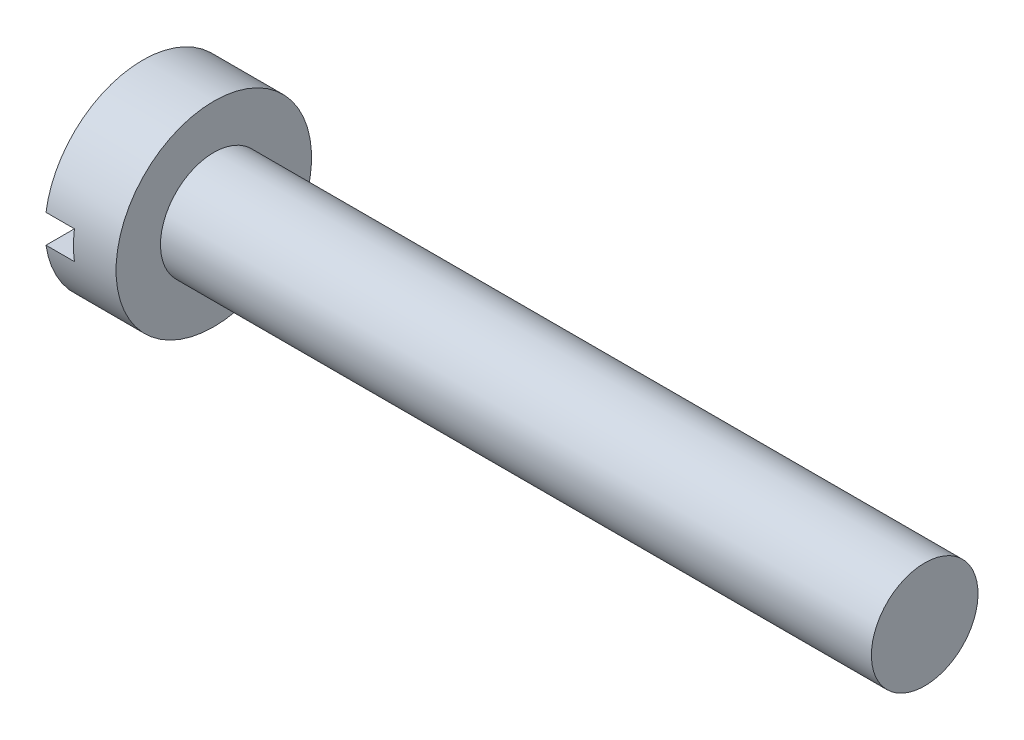
ISO-10303-21;
HEADER;
FILE_DESCRIPTION(('STEP AP214'),'2;1');
FILE_NAME('part.step','',(''),(''),'','','');
FILE_SCHEMA(('AUTOMOTIVE_DESIGN { 1 0 10303 214 1 1 1 1 }'));
ENDSEC;
DATA;
#1=APPLICATION_CONTEXT('core data for automotive mechanical design processes');
#2=APPLICATION_PROTOCOL_DEFINITION('international standard','automotive_design',2000,#1);
#3=PRODUCT_CONTEXT('',#1,'mechanical');
#4=PRODUCT('Part','Part','',(#3));
#5=PRODUCT_RELATED_PRODUCT_CATEGORY('part','',(#4));
#6=PRODUCT_DEFINITION_FORMATION('','',#4);
#7=PRODUCT_DEFINITION_CONTEXT('part definition',#1,'design');
#8=PRODUCT_DEFINITION('design','',#6,#7);
#9=PRODUCT_DEFINITION_SHAPE('','',#8);
#10=(LENGTH_UNIT() NAMED_UNIT(*) SI_UNIT(.MILLI.,.METRE.));
#11=(NAMED_UNIT(*) PLANE_ANGLE_UNIT() SI_UNIT($,.RADIAN.));
#12=(NAMED_UNIT(*) SI_UNIT($,.STERADIAN.) SOLID_ANGLE_UNIT());
#13=UNCERTAINTY_MEASURE_WITH_UNIT(LENGTH_MEASURE(1.E-05),#10,'distance_accuracy_value','');
#14=(GEOMETRIC_REPRESENTATION_CONTEXT(3) GLOBAL_UNCERTAINTY_ASSIGNED_CONTEXT((#13)) GLOBAL_UNIT_ASSIGNED_CONTEXT((#10,
#11,#12)) REPRESENTATION_CONTEXT('',''));
#15=CARTESIAN_POINT('',(0.,0.,0.));
#16=DIRECTION('',(0.,0.,1.));
#17=DIRECTION('',(1.,0.,0.));
#18=AXIS2_PLACEMENT_3D('',#15,#16,#17);
#19=CARTESIAN_POINT('',(0.,0.,0.));
#20=DIRECTION('',(-1.,0.,0.));
#21=DIRECTION('',(0.,-1.,0.));
#22=AXIS2_PLACEMENT_3D('',#19,#20,#21);
#23=PLANE('',#22);
#24=DIRECTION('',(0.,0.,-1.));
#25=VECTOR('',#24,1.);
#26=CARTESIAN_POINT('',(0.,0.399999999999997,-2.75));
#27=LINE('',#26,#25);
#28=CARTESIAN_POINT('',(0.,0.399999999999999,2.72075357208256));
#29=VERTEX_POINT('',#28);
#30=CARTESIAN_POINT('',(0.,0.399999999999997,-2.72075357208256));
#31=VERTEX_POINT('',#30);
#32=EDGE_CURVE('E83',#29,#31,#27,.T.);
#33=ORIENTED_EDGE('',*,*,#32,.F.);
#34=CARTESIAN_POINT('',(0.,0.,0.));
#35=DIRECTION('',(1.,0.,0.));
#36=DIRECTION('',(0.,1.,0.));
#37=AXIS2_PLACEMENT_3D('',#34,#35,#36);
#38=CIRCLE('',#37,2.75);
#39=EDGE_CURVE('E89',#31,#29,#38,.T.);
#40=ORIENTED_EDGE('',*,*,#39,.F.);
#41=EDGE_LOOP('',(#33,#40));
#42=FACE_BOUND('',#41,.T.);
#43=ADVANCED_FACE('F33',(#42),#23,.T.);
#44=DIRECTION('',(0.,0.,1.));
#45=VECTOR('',#44,1.);
#46=CARTESIAN_POINT('',(0.,-0.400000000000001,-2.75));
#47=LINE('',#46,#45);
#48=CARTESIAN_POINT('',(0.,-0.400000000000001,-2.72075357208256));
#49=VERTEX_POINT('',#48);
#50=CARTESIAN_POINT('',(0.,-0.399999999999999,2.72075357208256));
#51=VERTEX_POINT('',#50);
#52=EDGE_CURVE('E77',#49,#51,#47,.T.);
#53=ORIENTED_EDGE('',*,*,#52,.F.);
#54=EDGE_CURVE('E82',#51,#49,#38,.T.);
#55=ORIENTED_EDGE('',*,*,#54,.F.);
#56=EDGE_LOOP('',(#53,#55));
#57=FACE_BOUND('',#56,.T.);
#58=ADVANCED_FACE('F35',(#57),#23,.T.);
#59=CARTESIAN_POINT('',(22.,0.,0.));
#60=DIRECTION('',(1.,0.,0.));
#61=DIRECTION('',(0.,1.,0.));
#62=AXIS2_PLACEMENT_3D('',#59,#60,#61);
#63=CYLINDRICAL_SURFACE('',#62,2.75);
#64=DIRECTION('',(1.,0.,0.));
#65=VECTOR('',#64,1.);
#66=CARTESIAN_POINT('',(22.,0.399999999999997,-2.72075357208256));
#67=LINE('',#66,#65);
#68=CARTESIAN_POINT('',(0.799999999999999,0.399999999999997,-2.72075357208256));
#69=VERTEX_POINT('',#68);
#70=EDGE_CURVE('E11',#31,#69,#67,.T.);
#71=ORIENTED_EDGE('',*,*,#70,.F.);
#72=ORIENTED_EDGE('',*,*,#39,.T.);
#73=DIRECTION('',(1.,0.,0.));
#74=VECTOR('',#73,1.);
#75=CARTESIAN_POINT('',(22.,0.399999999999999,2.72075357208256));
#76=LINE('',#75,#74);
#77=CARTESIAN_POINT('',(0.799999999999999,0.399999999999999,2.72075357208256));
#78=VERTEX_POINT('',#77);
#79=EDGE_CURVE('E98',#78,#29,#76,.F.);
#80=ORIENTED_EDGE('',*,*,#79,.F.);
#81=CARTESIAN_POINT('',(0.799999999999999,0.,0.));
#82=DIRECTION('',(-1.,0.,0.));
#83=DIRECTION('',(0.,0.,1.));
#84=AXIS2_PLACEMENT_3D('',#81,#82,#83);
#85=CIRCLE('',#84,2.75);
#86=CARTESIAN_POINT('',(0.799999999999999,-0.399999999999999,2.72075357208256));
#87=VERTEX_POINT('',#86);
#88=EDGE_CURVE('E48',#78,#87,#85,.F.);
#89=ORIENTED_EDGE('',*,*,#88,.T.);
#90=DIRECTION('',(1.,0.,0.));
#91=VECTOR('',#90,1.);
#92=CARTESIAN_POINT('',(22.,-0.399999999999999,2.72075357208256));
#93=LINE('',#92,#91);
#94=EDGE_CURVE('E88',#51,#87,#93,.T.);
#95=ORIENTED_EDGE('',*,*,#94,.F.);
#96=ORIENTED_EDGE('',*,*,#54,.T.);
#97=DIRECTION('',(1.,0.,0.));
#98=VECTOR('',#97,1.);
#99=CARTESIAN_POINT('',(22.,-0.400000000000001,-2.72075357208256));
#100=LINE('',#99,#98);
#101=CARTESIAN_POINT('',(0.799999999999999,-0.400000000000001,-2.72075357208256));
#102=VERTEX_POINT('',#101);
#103=EDGE_CURVE('E41',#102,#49,#100,.F.);
#104=ORIENTED_EDGE('',*,*,#103,.F.);
#105=EDGE_CURVE('E56',#102,#69,#85,.F.);
#106=ORIENTED_EDGE('',*,*,#105,.T.);
#107=EDGE_LOOP('',(#71,#72,#80,#89,#95,#96,#104,#106));
#108=FACE_BOUND('',#107,.T.);
#109=CARTESIAN_POINT('',(2.,0.,0.));
#110=DIRECTION('',(1.,0.,0.));
#111=DIRECTION('',(0.,1.,0.));
#112=AXIS2_PLACEMENT_3D('',#109,#110,#111);
#113=CIRCLE('',#112,2.75);
#114=CARTESIAN_POINT('',(2.,2.75,0.));
#115=VERTEX_POINT('',#114);
#116=EDGE_CURVE('E93',#115,#115,#113,.T.);
#117=ORIENTED_EDGE('',*,*,#116,.F.);
#118=EDGE_LOOP('',(#117));
#119=FACE_BOUND('',#118,.T.);
#120=ADVANCED_FACE('F86',(#108,#119),#63,.T.);
#121=CARTESIAN_POINT('',(2.,2.75,0.));
#122=DIRECTION('',(1.,0.,0.));
#123=DIRECTION('',(0.,1.,0.));
#124=AXIS2_PLACEMENT_3D('',#121,#122,#123);
#125=PLANE('',#124);
#126=ORIENTED_EDGE('',*,*,#116,.T.);
#127=EDGE_LOOP('',(#126));
#128=FACE_BOUND('',#127,.T.);
#129=CARTESIAN_POINT('',(2.,0.,0.));
#130=DIRECTION('',(1.,0.,0.));
#131=DIRECTION('',(0.,1.,0.));
#132=AXIS2_PLACEMENT_3D('',#129,#130,#131);
#133=CIRCLE('',#132,1.5);
#134=CARTESIAN_POINT('',(2.,1.5,0.));
#135=VERTEX_POINT('',#134);
#136=EDGE_CURVE('E111',#135,#135,#133,.T.);
#137=ORIENTED_EDGE('',*,*,#136,.F.);
#138=EDGE_LOOP('',(#137));
#139=FACE_BOUND('',#138,.T.);
#140=ADVANCED_FACE('F118',(#128,#139),#125,.T.);
#141=CARTESIAN_POINT('',(22.,0.,0.));
#142=DIRECTION('',(1.,0.,0.));
#143=DIRECTION('',(0.,1.,0.));
#144=AXIS2_PLACEMENT_3D('',#141,#142,#143);
#145=CYLINDRICAL_SURFACE('',#144,1.5);
#146=ORIENTED_EDGE('',*,*,#136,.T.);
#147=EDGE_LOOP('',(#146));
#148=FACE_BOUND('',#147,.T.);
#149=CARTESIAN_POINT('',(22.,0.,0.));
#150=DIRECTION('',(1.,0.,0.));
#151=DIRECTION('',(0.,1.,0.));
#152=AXIS2_PLACEMENT_3D('',#149,#150,#151);
#153=CIRCLE('',#152,1.49999999999999);
#154=CARTESIAN_POINT('',(22.,1.5,0.));
#155=VERTEX_POINT('',#154);
#156=EDGE_CURVE('E109',#155,#155,#153,.T.);
#157=ORIENTED_EDGE('',*,*,#156,.F.);
#158=EDGE_LOOP('',(#157));
#159=FACE_BOUND('',#158,.T.);
#160=ADVANCED_FACE('F125',(#148,#159),#145,.T.);
#161=CARTESIAN_POINT('',(22.,1.5,0.));
#162=DIRECTION('',(1.,0.,0.));
#163=DIRECTION('',(0.,1.,0.));
#164=AXIS2_PLACEMENT_3D('',#161,#162,#163);
#165=PLANE('',#164);
#166=ORIENTED_EDGE('',*,*,#156,.T.);
#167=EDGE_LOOP('',(#166));
#168=FACE_BOUND('',#167,.T.);
#169=ADVANCED_FACE('F150',(#168),#165,.T.);
#170=CARTESIAN_POINT('',(0.8,0.399999999999997,-2.75));
#171=DIRECTION('',(0.,1.,0.));
#172=DIRECTION('',(0.,0.,1.));
#173=AXIS2_PLACEMENT_3D('',#170,#171,#172);
#174=PLANE('',#173);
#175=ORIENTED_EDGE('',*,*,#79,.T.);
#176=ORIENTED_EDGE('',*,*,#32,.T.);
#177=ORIENTED_EDGE('',*,*,#70,.T.);
#178=DIRECTION('',(0.,0.,-1.));
#179=VECTOR('',#178,1.);
#180=CARTESIAN_POINT('',(0.8,0.399999999999997,-2.75));
#181=LINE('',#180,#179);
#182=EDGE_CURVE('E105',#78,#69,#181,.T.);
#183=ORIENTED_EDGE('',*,*,#182,.F.);
#184=EDGE_LOOP('',(#175,#176,#177,#183));
#185=FACE_BOUND('',#184,.T.);
#186=ADVANCED_FACE('F145',(#185),#174,.F.);
#187=CARTESIAN_POINT('',(0.8,-0.400000000000001,-2.75));
#188=DIRECTION('',(0.,-1.,0.));
#189=DIRECTION('',(0.,0.,-1.));
#190=AXIS2_PLACEMENT_3D('',#187,#188,#189);
#191=PLANE('',#190);
#192=ORIENTED_EDGE('',*,*,#103,.T.);
#193=ORIENTED_EDGE('',*,*,#52,.T.);
#194=ORIENTED_EDGE('',*,*,#94,.T.);
#195=DIRECTION('',(0.,0.,1.));
#196=VECTOR('',#195,1.);
#197=CARTESIAN_POINT('',(0.8,-0.400000000000001,-2.75));
#198=LINE('',#197,#196);
#199=EDGE_CURVE('E78',#102,#87,#198,.T.);
#200=ORIENTED_EDGE('',*,*,#199,.F.);
#201=EDGE_LOOP('',(#192,#193,#194,#200));
#202=FACE_BOUND('',#201,.T.);
#203=ADVANCED_FACE('F76',(#202),#191,.F.);
#204=CARTESIAN_POINT('',(0.8,0.,0.));
#205=DIRECTION('',(-1.,0.,0.));
#206=DIRECTION('',(0.,0.,1.));
#207=AXIS2_PLACEMENT_3D('',#204,#205,#206);
#208=PLANE('',#207);
#209=ORIENTED_EDGE('',*,*,#199,.T.);
#210=ORIENTED_EDGE('',*,*,#88,.F.);
#211=ORIENTED_EDGE('',*,*,#182,.T.);
#212=ORIENTED_EDGE('',*,*,#105,.F.);
#213=EDGE_LOOP('',(#209,#210,#211,#212));
#214=FACE_BOUND('',#213,.T.);
#215=ADVANCED_FACE('F160',(#214),#208,.T.);
#216=CLOSED_SHELL('',(#43,#58,#120,#140,#160,#169,#186,#203,#215));
#217=MANIFOLD_SOLID_BREP('B2',#216);
#218=ADVANCED_BREP_SHAPE_REPRESENTATION('',(#18,#217),#14);
#219=SHAPE_DEFINITION_REPRESENTATION(#9,#218);
ENDSEC;
END-ISO-10303-21;
